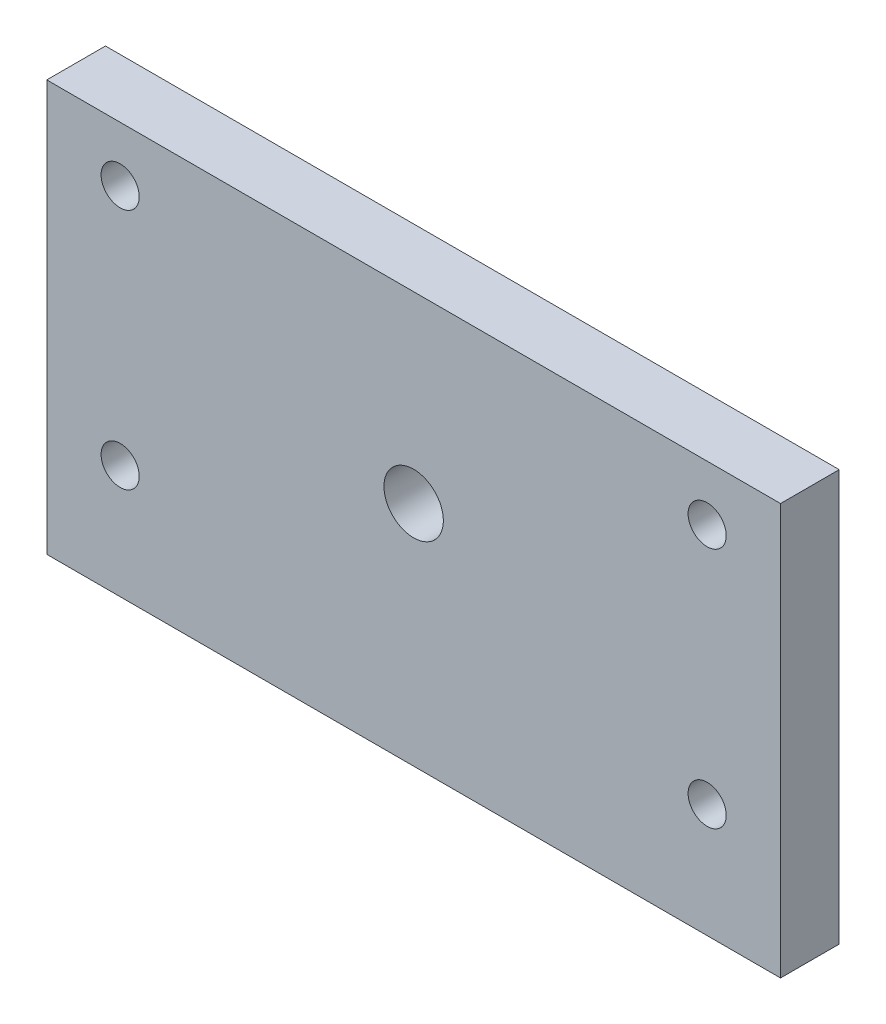
ISO-10303-21;
HEADER;
FILE_DESCRIPTION(('STEP AP214'),'2;1');
FILE_NAME('part.step','',(''),(''),'','','');
FILE_SCHEMA(('AUTOMOTIVE_DESIGN { 1 0 10303 214 1 1 1 1 }'));
ENDSEC;
DATA;
#1=APPLICATION_CONTEXT('core data for automotive mechanical design processes');
#2=APPLICATION_PROTOCOL_DEFINITION('international standard','automotive_design',2000,#1);
#3=PRODUCT_CONTEXT('',#1,'mechanical');
#4=PRODUCT('Part','Part','',(#3));
#5=PRODUCT_RELATED_PRODUCT_CATEGORY('part','',(#4));
#6=PRODUCT_DEFINITION_FORMATION('','',#4);
#7=PRODUCT_DEFINITION_CONTEXT('part definition',#1,'design');
#8=PRODUCT_DEFINITION('design','',#6,#7);
#9=PRODUCT_DEFINITION_SHAPE('','',#8);
#10=(LENGTH_UNIT() NAMED_UNIT(*) SI_UNIT(.MILLI.,.METRE.));
#11=(NAMED_UNIT(*) PLANE_ANGLE_UNIT() SI_UNIT($,.RADIAN.));
#12=(NAMED_UNIT(*) SI_UNIT($,.STERADIAN.) SOLID_ANGLE_UNIT());
#13=UNCERTAINTY_MEASURE_WITH_UNIT(LENGTH_MEASURE(1.E-05),#10,'distance_accuracy_value','');
#14=(GEOMETRIC_REPRESENTATION_CONTEXT(3) GLOBAL_UNCERTAINTY_ASSIGNED_CONTEXT((#13)) GLOBAL_UNIT_ASSIGNED_CONTEXT((#10,
#11,#12)) REPRESENTATION_CONTEXT('',''));
#15=CARTESIAN_POINT('',(0.,0.,0.));
#16=DIRECTION('',(0.,0.,1.));
#17=DIRECTION('',(1.,0.,0.));
#18=AXIS2_PLACEMENT_3D('',#15,#16,#17);
#19=CARTESIAN_POINT('',(0.,0.,8.));
#20=DIRECTION('',(0.,0.,1.));
#21=DIRECTION('',(1.,0.,0.));
#22=AXIS2_PLACEMENT_3D('',#19,#20,#21);
#23=PLANE('',#22);
#24=CARTESIAN_POINT('',(-32.6220828412006,-13.5297723292469,8.));
#25=DIRECTION('',(0.,0.,1.));
#26=DIRECTION('',(1.,0.,0.));
#27=AXIS2_PLACEMENT_3D('',#24,#25,#26);
#28=CIRCLE('',#27,2.59999999999998);
#29=CARTESIAN_POINT('',(-30.0220828412007,-13.5297723292469,8.));
#30=VERTEX_POINT('',#29);
#31=EDGE_CURVE('E135',#30,#30,#28,.T.);
#32=ORIENTED_EDGE('',*,*,#31,.F.);
#33=EDGE_LOOP('',(#32));
#34=FACE_BOUND('',#33,.T.);
#35=CARTESIAN_POINT('',(47.3779171587994,-13.5297723292469,8.));
#36=DIRECTION('',(0.,0.,1.));
#37=DIRECTION('',(1.,0.,0.));
#38=AXIS2_PLACEMENT_3D('',#35,#36,#37);
#39=CIRCLE('',#38,2.59999999999999);
#40=CARTESIAN_POINT('',(49.9779171587994,-13.5297723292469,8.));
#41=VERTEX_POINT('',#40);
#42=EDGE_CURVE('E138',#41,#41,#39,.T.);
#43=ORIENTED_EDGE('',*,*,#42,.F.);
#44=EDGE_LOOP('',(#43));
#45=FACE_BOUND('',#44,.T.);
#46=CARTESIAN_POINT('',(47.3779171587994,19.4702276707531,8.));
#47=DIRECTION('',(0.,0.,1.));
#48=DIRECTION('',(1.,0.,0.));
#49=AXIS2_PLACEMENT_3D('',#46,#47,#48);
#50=CIRCLE('',#49,2.59999999999999);
#51=CARTESIAN_POINT('',(49.9779171587994,19.4702276707531,8.));
#52=VERTEX_POINT('',#51);
#53=EDGE_CURVE('E134',#52,#52,#50,.T.);
#54=ORIENTED_EDGE('',*,*,#53,.F.);
#55=EDGE_LOOP('',(#54));
#56=FACE_BOUND('',#55,.T.);
#57=CARTESIAN_POINT('',(-32.6220828412006,19.4702276707531,8.));
#58=DIRECTION('',(0.,0.,1.));
#59=DIRECTION('',(1.,0.,0.));
#60=AXIS2_PLACEMENT_3D('',#57,#58,#59);
#61=CIRCLE('',#60,2.59999999999998);
#62=CARTESIAN_POINT('',(-30.0220828412007,19.4702276707531,8.));
#63=VERTEX_POINT('',#62);
#64=EDGE_CURVE('E115',#63,#63,#61,.T.);
#65=ORIENTED_EDGE('',*,*,#64,.F.);
#66=EDGE_LOOP('',(#65));
#67=FACE_BOUND('',#66,.T.);
#68=DIRECTION('',(0.,-1.,0.));
#69=VECTOR('',#68,1.);
#70=CARTESIAN_POINT('',(-42.6220828412006,26.9702276707531,8.));
#71=LINE('',#70,#69);
#72=CARTESIAN_POINT('',(-42.6220828412006,26.9702276707531,8.));
#73=VERTEX_POINT('',#72);
#74=CARTESIAN_POINT('',(-42.6220828412006,-29.0297723292469,8.));
#75=VERTEX_POINT('',#74);
#76=EDGE_CURVE('E89',#73,#75,#71,.T.);
#77=ORIENTED_EDGE('',*,*,#76,.T.);
#78=DIRECTION('',(1.,0.,0.));
#79=VECTOR('',#78,1.);
#80=CARTESIAN_POINT('',(-42.6220828412006,-29.0297723292469,8.));
#81=LINE('',#80,#79);
#82=CARTESIAN_POINT('',(57.3779171587994,-29.0297723292469,8.));
#83=VERTEX_POINT('',#82);
#84=EDGE_CURVE('E84',#75,#83,#81,.T.);
#85=ORIENTED_EDGE('',*,*,#84,.T.);
#86=DIRECTION('',(0.,1.,0.));
#87=VECTOR('',#86,1.);
#88=CARTESIAN_POINT('',(57.3779171587994,26.9702276707531,8.));
#89=LINE('',#88,#87);
#90=CARTESIAN_POINT('',(57.3779171587994,26.9702276707531,8.));
#91=VERTEX_POINT('',#90);
#92=EDGE_CURVE('E87',#83,#91,#89,.T.);
#93=ORIENTED_EDGE('',*,*,#92,.T.);
#94=DIRECTION('',(-1.,0.,0.));
#95=VECTOR('',#94,1.);
#96=CARTESIAN_POINT('',(-42.6220828412006,26.9702276707531,8.));
#97=LINE('',#96,#95);
#98=EDGE_CURVE('E54',#91,#73,#97,.T.);
#99=ORIENTED_EDGE('',*,*,#98,.T.);
#100=EDGE_LOOP('',(#77,#85,#93,#99));
#101=FACE_BOUND('',#100,.T.);
#102=CARTESIAN_POINT('',(7.37791715879937,1.97022767075306,8.));
#103=DIRECTION('',(0.,0.,1.));
#104=DIRECTION('',(1.,0.,0.));
#105=AXIS2_PLACEMENT_3D('',#102,#103,#104);
#106=CIRCLE('',#105,4.05);
#107=CARTESIAN_POINT('',(11.4279171587994,1.97022767075306,8.));
#108=VERTEX_POINT('',#107);
#109=EDGE_CURVE('E105',#108,#108,#106,.T.);
#110=ORIENTED_EDGE('',*,*,#109,.F.);
#111=EDGE_LOOP('',(#110));
#112=FACE_BOUND('',#111,.T.);
#113=ADVANCED_FACE('F35',(#34,#45,#56,#67,#101,#112),#23,.T.);
#114=CARTESIAN_POINT('',(0.,0.,0.));
#115=DIRECTION('',(0.,0.,1.));
#116=DIRECTION('',(1.,0.,0.));
#117=AXIS2_PLACEMENT_3D('',#114,#115,#116);
#118=PLANE('',#117);
#119=CARTESIAN_POINT('',(-32.6220828412006,-13.5297723292469,0.));
#120=DIRECTION('',(0.,0.,1.));
#121=DIRECTION('',(1.,0.,0.));
#122=AXIS2_PLACEMENT_3D('',#119,#120,#121);
#123=CIRCLE('',#122,2.59999999999998);
#124=CARTESIAN_POINT('',(-30.0220828412007,-13.5297723292469,0.));
#125=VERTEX_POINT('',#124);
#126=EDGE_CURVE('E39',#125,#125,#123,.T.);
#127=ORIENTED_EDGE('',*,*,#126,.T.);
#128=EDGE_LOOP('',(#127));
#129=FACE_BOUND('',#128,.T.);
#130=CARTESIAN_POINT('',(47.3779171587994,-13.5297723292469,0.));
#131=DIRECTION('',(0.,0.,1.));
#132=DIRECTION('',(1.,0.,0.));
#133=AXIS2_PLACEMENT_3D('',#130,#131,#132);
#134=CIRCLE('',#133,2.59999999999999);
#135=CARTESIAN_POINT('',(49.9779171587994,-13.5297723292469,0.));
#136=VERTEX_POINT('',#135);
#137=EDGE_CURVE('E117',#136,#136,#134,.T.);
#138=ORIENTED_EDGE('',*,*,#137,.T.);
#139=EDGE_LOOP('',(#138));
#140=FACE_BOUND('',#139,.T.);
#141=CARTESIAN_POINT('',(47.3779171587994,19.4702276707531,0.));
#142=DIRECTION('',(0.,0.,1.));
#143=DIRECTION('',(1.,0.,0.));
#144=AXIS2_PLACEMENT_3D('',#141,#142,#143);
#145=CIRCLE('',#144,2.59999999999999);
#146=CARTESIAN_POINT('',(49.9779171587994,19.4702276707531,0.));
#147=VERTEX_POINT('',#146);
#148=EDGE_CURVE('E114',#147,#147,#145,.T.);
#149=ORIENTED_EDGE('',*,*,#148,.T.);
#150=EDGE_LOOP('',(#149));
#151=FACE_BOUND('',#150,.T.);
#152=CARTESIAN_POINT('',(-32.6220828412006,19.4702276707531,0.));
#153=DIRECTION('',(0.,0.,1.));
#154=DIRECTION('',(1.,0.,0.));
#155=AXIS2_PLACEMENT_3D('',#152,#153,#154);
#156=CIRCLE('',#155,2.59999999999998);
#157=CARTESIAN_POINT('',(-30.0220828412007,19.4702276707531,0.));
#158=VERTEX_POINT('',#157);
#159=EDGE_CURVE('E111',#158,#158,#156,.T.);
#160=ORIENTED_EDGE('',*,*,#159,.T.);
#161=EDGE_LOOP('',(#160));
#162=FACE_BOUND('',#161,.T.);
#163=DIRECTION('',(0.,-1.,0.));
#164=VECTOR('',#163,1.);
#165=CARTESIAN_POINT('',(-42.6220828412006,26.9702276707531,0.));
#166=LINE('',#165,#164);
#167=CARTESIAN_POINT('',(-42.6220828412006,26.9702276707531,0.));
#168=VERTEX_POINT('',#167);
#169=CARTESIAN_POINT('',(-42.6220828412006,-29.0297723292469,0.));
#170=VERTEX_POINT('',#169);
#171=EDGE_CURVE('E102',#168,#170,#166,.T.);
#172=ORIENTED_EDGE('',*,*,#171,.F.);
#173=DIRECTION('',(-1.,0.,0.));
#174=VECTOR('',#173,1.);
#175=CARTESIAN_POINT('',(-42.6220828412006,26.9702276707531,0.));
#176=LINE('',#175,#174);
#177=CARTESIAN_POINT('',(57.3779171587994,26.9702276707531,0.));
#178=VERTEX_POINT('',#177);
#179=EDGE_CURVE('E77',#178,#168,#176,.T.);
#180=ORIENTED_EDGE('',*,*,#179,.F.);
#181=DIRECTION('',(0.,1.,0.));
#182=VECTOR('',#181,1.);
#183=CARTESIAN_POINT('',(57.3779171587994,26.9702276707531,0.));
#184=LINE('',#183,#182);
#185=CARTESIAN_POINT('',(57.3779171587994,-29.0297723292469,0.));
#186=VERTEX_POINT('',#185);
#187=EDGE_CURVE('E71',#186,#178,#184,.T.);
#188=ORIENTED_EDGE('',*,*,#187,.F.);
#189=DIRECTION('',(1.,0.,0.));
#190=VECTOR('',#189,1.);
#191=CARTESIAN_POINT('',(-42.6220828412006,-29.0297723292469,0.));
#192=LINE('',#191,#190);
#193=EDGE_CURVE('E93',#170,#186,#192,.T.);
#194=ORIENTED_EDGE('',*,*,#193,.F.);
#195=EDGE_LOOP('',(#172,#180,#188,#194));
#196=FACE_BOUND('',#195,.T.);
#197=CARTESIAN_POINT('',(7.37791715879937,1.97022767075306,0.));
#198=DIRECTION('',(0.,0.,1.));
#199=DIRECTION('',(1.,0.,0.));
#200=AXIS2_PLACEMENT_3D('',#197,#198,#199);
#201=CIRCLE('',#200,4.05);
#202=CARTESIAN_POINT('',(11.4279171587994,1.97022767075306,0.));
#203=VERTEX_POINT('',#202);
#204=EDGE_CURVE('E122',#203,#203,#201,.T.);
#205=ORIENTED_EDGE('',*,*,#204,.T.);
#206=EDGE_LOOP('',(#205));
#207=FACE_BOUND('',#206,.T.);
#208=ADVANCED_FACE('F149',(#129,#140,#151,#162,#196,#207),#118,.F.);
#209=CARTESIAN_POINT('',(-42.6220828412006,26.9702276707531,8.));
#210=DIRECTION('',(1.,0.,0.));
#211=DIRECTION('',(0.,0.,-1.));
#212=AXIS2_PLACEMENT_3D('',#209,#210,#211);
#213=PLANE('',#212);
#214=ORIENTED_EDGE('',*,*,#171,.T.);
#215=DIRECTION('',(0.,0.,-1.));
#216=VECTOR('',#215,1.);
#217=CARTESIAN_POINT('',(-42.6220828412006,-29.0297723292469,8.));
#218=LINE('',#217,#216);
#219=EDGE_CURVE('E11',#75,#170,#218,.T.);
#220=ORIENTED_EDGE('',*,*,#219,.F.);
#221=ORIENTED_EDGE('',*,*,#76,.F.);
#222=DIRECTION('',(0.,0.,-1.));
#223=VECTOR('',#222,1.);
#224=CARTESIAN_POINT('',(-42.6220828412006,26.9702276707531,8.));
#225=LINE('',#224,#223);
#226=EDGE_CURVE('E98',#73,#168,#225,.T.);
#227=ORIENTED_EDGE('',*,*,#226,.T.);
#228=EDGE_LOOP('',(#214,#220,#221,#227));
#229=FACE_BOUND('',#228,.T.);
#230=ADVANCED_FACE('F37',(#229),#213,.F.);
#231=CARTESIAN_POINT('',(-42.6220828412006,-29.0297723292469,8.));
#232=DIRECTION('',(0.,1.,0.));
#233=DIRECTION('',(0.,0.,1.));
#234=AXIS2_PLACEMENT_3D('',#231,#232,#233);
#235=PLANE('',#234);
#236=ORIENTED_EDGE('',*,*,#193,.T.);
#237=DIRECTION('',(0.,0.,-1.));
#238=VECTOR('',#237,1.);
#239=CARTESIAN_POINT('',(57.3779171587994,-29.0297723292469,8.));
#240=LINE('',#239,#238);
#241=EDGE_CURVE('E45',#83,#186,#240,.T.);
#242=ORIENTED_EDGE('',*,*,#241,.F.);
#243=ORIENTED_EDGE('',*,*,#84,.F.);
#244=ORIENTED_EDGE('',*,*,#219,.T.);
#245=EDGE_LOOP('',(#236,#242,#243,#244));
#246=FACE_BOUND('',#245,.T.);
#247=ADVANCED_FACE('F92',(#246),#235,.F.);
#248=CARTESIAN_POINT('',(57.3779171587994,26.9702276707531,8.));
#249=DIRECTION('',(-1.,0.,0.));
#250=DIRECTION('',(0.,-1.,0.));
#251=AXIS2_PLACEMENT_3D('',#248,#249,#250);
#252=PLANE('',#251);
#253=ORIENTED_EDGE('',*,*,#187,.T.);
#254=DIRECTION('',(0.,0.,-1.));
#255=VECTOR('',#254,1.);
#256=CARTESIAN_POINT('',(57.3779171587994,26.9702276707531,8.));
#257=LINE('',#256,#255);
#258=EDGE_CURVE('E94',#91,#178,#257,.T.);
#259=ORIENTED_EDGE('',*,*,#258,.F.);
#260=ORIENTED_EDGE('',*,*,#92,.F.);
#261=ORIENTED_EDGE('',*,*,#241,.T.);
#262=EDGE_LOOP('',(#253,#259,#260,#261));
#263=FACE_BOUND('',#262,.T.);
#264=ADVANCED_FACE('F96',(#263),#252,.F.);
#265=CARTESIAN_POINT('',(-42.6220828412006,26.9702276707531,8.));
#266=DIRECTION('',(0.,-1.,0.));
#267=DIRECTION('',(0.,0.,-1.));
#268=AXIS2_PLACEMENT_3D('',#265,#266,#267);
#269=PLANE('',#268);
#270=ORIENTED_EDGE('',*,*,#179,.T.);
#271=ORIENTED_EDGE('',*,*,#226,.F.);
#272=ORIENTED_EDGE('',*,*,#98,.F.);
#273=ORIENTED_EDGE('',*,*,#258,.T.);
#274=EDGE_LOOP('',(#270,#271,#272,#273));
#275=FACE_BOUND('',#274,.T.);
#276=ADVANCED_FACE('F166',(#275),#269,.F.);
#277=CARTESIAN_POINT('',(7.37791715879937,1.97022767075306,8.));
#278=DIRECTION('',(0.,0.,-1.));
#279=DIRECTION('',(-1.,0.,0.));
#280=AXIS2_PLACEMENT_3D('',#277,#278,#279);
#281=CYLINDRICAL_SURFACE('',#280,4.05);
#282=ORIENTED_EDGE('',*,*,#109,.T.);
#283=EDGE_LOOP('',(#282));
#284=FACE_BOUND('',#283,.T.);
#285=ORIENTED_EDGE('',*,*,#204,.F.);
#286=EDGE_LOOP('',(#285));
#287=FACE_BOUND('',#286,.T.);
#288=ADVANCED_FACE('F157',(#284,#287),#281,.F.);
#289=CARTESIAN_POINT('',(-32.6220828412006,19.4702276707531,-2.));
#290=DIRECTION('',(0.,0.,1.));
#291=DIRECTION('',(1.,0.,0.));
#292=AXIS2_PLACEMENT_3D('',#289,#290,#291);
#293=CYLINDRICAL_SURFACE('',#292,2.59999999999998);
#294=ORIENTED_EDGE('',*,*,#64,.T.);
#295=EDGE_LOOP('',(#294));
#296=FACE_BOUND('',#295,.T.);
#297=ORIENTED_EDGE('',*,*,#159,.F.);
#298=EDGE_LOOP('',(#297));
#299=FACE_BOUND('',#298,.T.);
#300=ADVANCED_FACE('F154',(#296,#299),#293,.F.);
#301=CARTESIAN_POINT('',(47.3779171587994,19.4702276707531,-2.));
#302=DIRECTION('',(0.,0.,1.));
#303=DIRECTION('',(1.,0.,0.));
#304=AXIS2_PLACEMENT_3D('',#301,#302,#303);
#305=CYLINDRICAL_SURFACE('',#304,2.59999999999999);
#306=ORIENTED_EDGE('',*,*,#53,.T.);
#307=EDGE_LOOP('',(#306));
#308=FACE_BOUND('',#307,.T.);
#309=ORIENTED_EDGE('',*,*,#148,.F.);
#310=EDGE_LOOP('',(#309));
#311=FACE_BOUND('',#310,.T.);
#312=ADVANCED_FACE('F144',(#308,#311),#305,.F.);
#313=CARTESIAN_POINT('',(47.3779171587994,-13.5297723292469,-2.));
#314=DIRECTION('',(0.,0.,1.));
#315=DIRECTION('',(1.,0.,0.));
#316=AXIS2_PLACEMENT_3D('',#313,#314,#315);
#317=CYLINDRICAL_SURFACE('',#316,2.59999999999999);
#318=ORIENTED_EDGE('',*,*,#42,.T.);
#319=EDGE_LOOP('',(#318));
#320=FACE_BOUND('',#319,.T.);
#321=ORIENTED_EDGE('',*,*,#137,.F.);
#322=EDGE_LOOP('',(#321));
#323=FACE_BOUND('',#322,.T.);
#324=ADVANCED_FACE('F226',(#320,#323),#317,.F.);
#325=CARTESIAN_POINT('',(-32.6220828412006,-13.5297723292469,-2.));
#326=DIRECTION('',(0.,0.,1.));
#327=DIRECTION('',(1.,0.,0.));
#328=AXIS2_PLACEMENT_3D('',#325,#326,#327);
#329=CYLINDRICAL_SURFACE('',#328,2.59999999999998);
#330=ORIENTED_EDGE('',*,*,#31,.T.);
#331=EDGE_LOOP('',(#330));
#332=FACE_BOUND('',#331,.T.);
#333=ORIENTED_EDGE('',*,*,#126,.F.);
#334=EDGE_LOOP('',(#333));
#335=FACE_BOUND('',#334,.T.);
#336=ADVANCED_FACE('F233',(#332,#335),#329,.F.);
#337=CLOSED_SHELL('',(#113,#208,#230,#247,#264,#276,#288,#300,#312,#324,#336));
#338=MANIFOLD_SOLID_BREP('B2',#337);
#339=ADVANCED_BREP_SHAPE_REPRESENTATION('',(#18,#338),#14);
#340=SHAPE_DEFINITION_REPRESENTATION(#9,#339);
ENDSEC;
END-ISO-10303-21;
